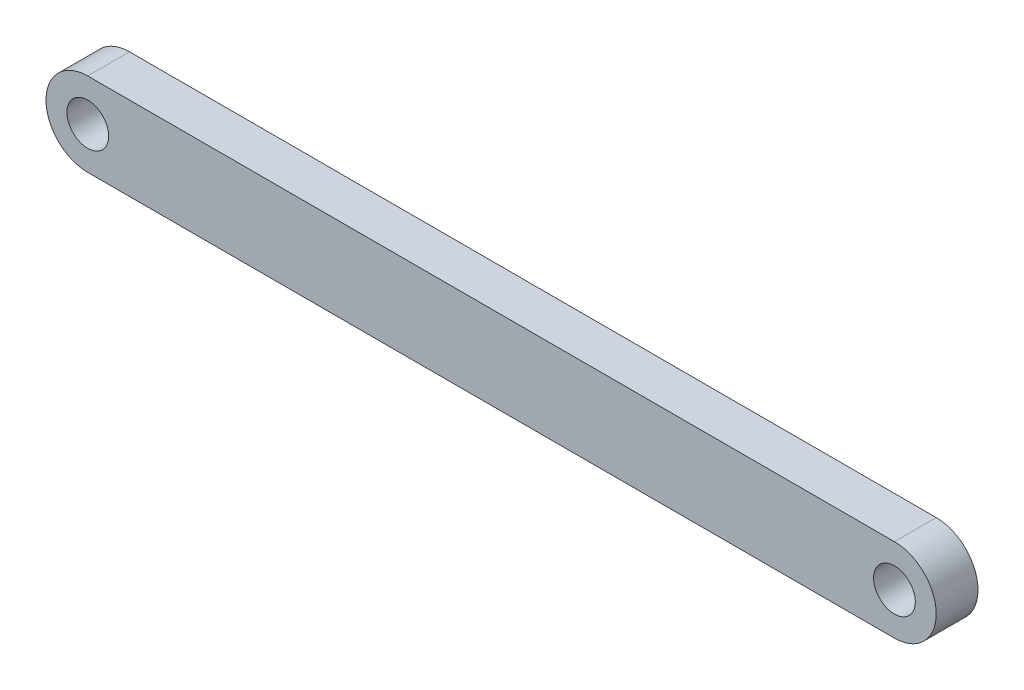
ISO-10303-21;
HEADER;
FILE_DESCRIPTION(('STEP AP214'),'2;1');
FILE_NAME('part.step','',(''),(''),'','','');
FILE_SCHEMA(('AUTOMOTIVE_DESIGN { 1 0 10303 214 1 1 1 1 }'));
ENDSEC;
DATA;
#1=APPLICATION_CONTEXT('core data for automotive mechanical design processes');
#2=APPLICATION_PROTOCOL_DEFINITION('international standard','automotive_design',2000,#1);
#3=PRODUCT_CONTEXT('',#1,'mechanical');
#4=PRODUCT('Part','Part','',(#3));
#5=PRODUCT_RELATED_PRODUCT_CATEGORY('part','',(#4));
#6=PRODUCT_DEFINITION_FORMATION('','',#4);
#7=PRODUCT_DEFINITION_CONTEXT('part definition',#1,'design');
#8=PRODUCT_DEFINITION('design','',#6,#7);
#9=PRODUCT_DEFINITION_SHAPE('','',#8);
#10=(LENGTH_UNIT() NAMED_UNIT(*) SI_UNIT(.MILLI.,.METRE.));
#11=(NAMED_UNIT(*) PLANE_ANGLE_UNIT() SI_UNIT($,.RADIAN.));
#12=(NAMED_UNIT(*) SI_UNIT($,.STERADIAN.) SOLID_ANGLE_UNIT());
#13=UNCERTAINTY_MEASURE_WITH_UNIT(LENGTH_MEASURE(1.E-05),#10,'distance_accuracy_value','');
#14=(GEOMETRIC_REPRESENTATION_CONTEXT(3) GLOBAL_UNCERTAINTY_ASSIGNED_CONTEXT((#13)) GLOBAL_UNIT_ASSIGNED_CONTEXT((#10,
#11,#12)) REPRESENTATION_CONTEXT('',''));
#15=CARTESIAN_POINT('',(0.,0.,0.));
#16=DIRECTION('',(0.,0.,1.));
#17=DIRECTION('',(1.,0.,0.));
#18=AXIS2_PLACEMENT_3D('',#15,#16,#17);
#19=CARTESIAN_POINT('',(12.58,0.,5.));
#20=DIRECTION('',(0.,0.,-1.));
#21=DIRECTION('',(-1.,0.,0.));
#22=AXIS2_PLACEMENT_3D('',#19,#20,#21);
#23=PLANE('',#22);
#24=CARTESIAN_POINT('',(12.58,0.,5.));
#25=DIRECTION('',(0.,0.,1.));
#26=DIRECTION('',(-1.,0.,0.));
#27=AXIS2_PLACEMENT_3D('',#24,#25,#26);
#28=CIRCLE('',#27,5.);
#29=CARTESIAN_POINT('',(12.58,-5.,5.));
#30=VERTEX_POINT('',#29);
#31=CARTESIAN_POINT('',(12.58,5.,5.));
#32=VERTEX_POINT('',#31);
#33=EDGE_CURVE('E96',#30,#32,#28,.T.);
#34=ORIENTED_EDGE('',*,*,#33,.T.);
#35=DIRECTION('',(-1.,0.,0.));
#36=VECTOR('',#35,1.);
#37=CARTESIAN_POINT('',(-83.96,5.,5.));
#38=LINE('',#37,#36);
#39=CARTESIAN_POINT('',(-83.96,5.,5.));
#40=VERTEX_POINT('',#39);
#41=EDGE_CURVE('E91',#32,#40,#38,.T.);
#42=ORIENTED_EDGE('',*,*,#41,.T.);
#43=CARTESIAN_POINT('',(-83.96,0.,5.));
#44=DIRECTION('',(0.,0.,1.));
#45=DIRECTION('',(1.,0.,0.));
#46=AXIS2_PLACEMENT_3D('',#43,#44,#45);
#47=CIRCLE('',#46,5.);
#48=CARTESIAN_POINT('',(-83.96,-5.,5.));
#49=VERTEX_POINT('',#48);
#50=EDGE_CURVE('E94',#40,#49,#47,.T.);
#51=ORIENTED_EDGE('',*,*,#50,.T.);
#52=DIRECTION('',(1.,0.,0.));
#53=VECTOR('',#52,1.);
#54=CARTESIAN_POINT('',(-83.96,-5.,5.));
#55=LINE('',#54,#53);
#56=EDGE_CURVE('E61',#49,#30,#55,.T.);
#57=ORIENTED_EDGE('',*,*,#56,.T.);
#58=EDGE_LOOP('',(#34,#42,#51,#57));
#59=FACE_BOUND('',#58,.T.);
#60=CARTESIAN_POINT('',(12.58,0.,5.));
#61=DIRECTION('',(0.,0.,1.));
#62=DIRECTION('',(1.,0.,0.));
#63=AXIS2_PLACEMENT_3D('',#60,#61,#62);
#64=CIRCLE('',#63,2.5);
#65=CARTESIAN_POINT('',(15.08,0.,5.));
#66=VERTEX_POINT('',#65);
#67=EDGE_CURVE('E116',#66,#66,#64,.T.);
#68=ORIENTED_EDGE('',*,*,#67,.F.);
#69=EDGE_LOOP('',(#68));
#70=FACE_BOUND('',#69,.T.);
#71=CARTESIAN_POINT('',(-83.96,0.,5.));
#72=DIRECTION('',(0.,0.,1.));
#73=DIRECTION('',(1.,0.,0.));
#74=AXIS2_PLACEMENT_3D('',#71,#72,#73);
#75=CIRCLE('',#74,2.5);
#76=CARTESIAN_POINT('',(-81.46,0.,5.));
#77=VERTEX_POINT('',#76);
#78=EDGE_CURVE('E138',#77,#77,#75,.T.);
#79=ORIENTED_EDGE('',*,*,#78,.F.);
#80=EDGE_LOOP('',(#79));
#81=FACE_BOUND('',#80,.T.);
#82=ADVANCED_FACE('F43',(#59,#70,#81),#23,.F.);
#83=CARTESIAN_POINT('',(12.58,0.,0.));
#84=DIRECTION('',(0.,0.,-1.));
#85=DIRECTION('',(-1.,0.,0.));
#86=AXIS2_PLACEMENT_3D('',#83,#84,#85);
#87=PLANE('',#86);
#88=CARTESIAN_POINT('',(12.58,0.,0.));
#89=DIRECTION('',(0.,0.,1.));
#90=DIRECTION('',(1.,0.,0.));
#91=AXIS2_PLACEMENT_3D('',#88,#89,#90);
#92=CIRCLE('',#91,2.5);
#93=CARTESIAN_POINT('',(15.08,0.,0.));
#94=VERTEX_POINT('',#93);
#95=EDGE_CURVE('E134',#94,#94,#92,.T.);
#96=ORIENTED_EDGE('',*,*,#95,.T.);
#97=EDGE_LOOP('',(#96));
#98=FACE_BOUND('',#97,.T.);
#99=CARTESIAN_POINT('',(12.58,0.,0.));
#100=DIRECTION('',(0.,0.,1.));
#101=DIRECTION('',(-1.,0.,0.));
#102=AXIS2_PLACEMENT_3D('',#99,#100,#101);
#103=CIRCLE('',#102,5.);
#104=CARTESIAN_POINT('',(12.58,-5.,0.));
#105=VERTEX_POINT('',#104);
#106=CARTESIAN_POINT('',(12.58,5.,0.));
#107=VERTEX_POINT('',#106);
#108=EDGE_CURVE('E112',#105,#107,#103,.T.);
#109=ORIENTED_EDGE('',*,*,#108,.F.);
#110=DIRECTION('',(1.,0.,0.));
#111=VECTOR('',#110,1.);
#112=CARTESIAN_POINT('',(-83.96,-5.,0.));
#113=LINE('',#112,#111);
#114=CARTESIAN_POINT('',(-83.96,-5.,0.));
#115=VERTEX_POINT('',#114);
#116=EDGE_CURVE('E84',#115,#105,#113,.T.);
#117=ORIENTED_EDGE('',*,*,#116,.F.);
#118=CARTESIAN_POINT('',(-83.96,0.,0.));
#119=DIRECTION('',(0.,0.,1.));
#120=DIRECTION('',(1.,0.,0.));
#121=AXIS2_PLACEMENT_3D('',#118,#119,#120);
#122=CIRCLE('',#121,5.);
#123=CARTESIAN_POINT('',(-83.96,5.,0.));
#124=VERTEX_POINT('',#123);
#125=EDGE_CURVE('E78',#124,#115,#122,.T.);
#126=ORIENTED_EDGE('',*,*,#125,.F.);
#127=DIRECTION('',(-1.,0.,0.));
#128=VECTOR('',#127,1.);
#129=CARTESIAN_POINT('',(-83.96,5.,0.));
#130=LINE('',#129,#128);
#131=EDGE_CURVE('E101',#107,#124,#130,.T.);
#132=ORIENTED_EDGE('',*,*,#131,.F.);
#133=EDGE_LOOP('',(#109,#117,#126,#132));
#134=FACE_BOUND('',#133,.T.);
#135=CARTESIAN_POINT('',(-83.96,0.,0.));
#136=DIRECTION('',(0.,0.,1.));
#137=DIRECTION('',(1.,0.,0.));
#138=AXIS2_PLACEMENT_3D('',#135,#136,#137);
#139=CIRCLE('',#138,2.5);
#140=CARTESIAN_POINT('',(-81.46,0.,0.));
#141=VERTEX_POINT('',#140);
#142=EDGE_CURVE('E142',#141,#141,#139,.T.);
#143=ORIENTED_EDGE('',*,*,#142,.T.);
#144=EDGE_LOOP('',(#143));
#145=FACE_BOUND('',#144,.T.);
#146=ADVANCED_FACE('F129',(#98,#134,#145),#87,.T.);
#147=CARTESIAN_POINT('',(12.58,0.,5.));
#148=DIRECTION('',(0.,0.,-1.));
#149=DIRECTION('',(-1.,0.,0.));
#150=AXIS2_PLACEMENT_3D('',#147,#148,#149);
#151=CYLINDRICAL_SURFACE('',#150,5.);
#152=ORIENTED_EDGE('',*,*,#108,.T.);
#153=DIRECTION('',(0.,0.,-1.));
#154=VECTOR('',#153,1.);
#155=CARTESIAN_POINT('',(12.58,5.,5.));
#156=LINE('',#155,#154);
#157=EDGE_CURVE('E11',#32,#107,#156,.T.);
#158=ORIENTED_EDGE('',*,*,#157,.F.);
#159=ORIENTED_EDGE('',*,*,#33,.F.);
#160=DIRECTION('',(0.,0.,-1.));
#161=VECTOR('',#160,1.);
#162=CARTESIAN_POINT('',(12.58,-5.,5.));
#163=LINE('',#162,#161);
#164=EDGE_CURVE('E108',#30,#105,#163,.T.);
#165=ORIENTED_EDGE('',*,*,#164,.T.);
#166=EDGE_LOOP('',(#152,#158,#159,#165));
#167=FACE_BOUND('',#166,.T.);
#168=ADVANCED_FACE('F45',(#167),#151,.T.);
#169=CARTESIAN_POINT('',(-83.96,5.,5.));
#170=DIRECTION('',(0.,-1.,0.));
#171=DIRECTION('',(0.,0.,-1.));
#172=AXIS2_PLACEMENT_3D('',#169,#170,#171);
#173=PLANE('',#172);
#174=ORIENTED_EDGE('',*,*,#131,.T.);
#175=DIRECTION('',(0.,0.,-1.));
#176=VECTOR('',#175,1.);
#177=CARTESIAN_POINT('',(-83.96,5.,5.));
#178=LINE('',#177,#176);
#179=EDGE_CURVE('E53',#40,#124,#178,.T.);
#180=ORIENTED_EDGE('',*,*,#179,.F.);
#181=ORIENTED_EDGE('',*,*,#41,.F.);
#182=ORIENTED_EDGE('',*,*,#157,.T.);
#183=EDGE_LOOP('',(#174,#180,#181,#182));
#184=FACE_BOUND('',#183,.T.);
#185=ADVANCED_FACE('F100',(#184),#173,.F.);
#186=CARTESIAN_POINT('',(-83.96,0.,5.));
#187=DIRECTION('',(0.,0.,-1.));
#188=DIRECTION('',(-1.,0.,0.));
#189=AXIS2_PLACEMENT_3D('',#186,#187,#188);
#190=CYLINDRICAL_SURFACE('',#189,5.);
#191=ORIENTED_EDGE('',*,*,#125,.T.);
#192=DIRECTION('',(0.,0.,-1.));
#193=VECTOR('',#192,1.);
#194=CARTESIAN_POINT('',(-83.96,-5.,5.));
#195=LINE('',#194,#193);
#196=EDGE_CURVE('E103',#49,#115,#195,.T.);
#197=ORIENTED_EDGE('',*,*,#196,.F.);
#198=ORIENTED_EDGE('',*,*,#50,.F.);
#199=ORIENTED_EDGE('',*,*,#179,.T.);
#200=EDGE_LOOP('',(#191,#197,#198,#199));
#201=FACE_BOUND('',#200,.T.);
#202=ADVANCED_FACE('F104',(#201),#190,.T.);
#203=CARTESIAN_POINT('',(-83.96,-5.,5.));
#204=DIRECTION('',(0.,1.,0.));
#205=DIRECTION('',(0.,0.,1.));
#206=AXIS2_PLACEMENT_3D('',#203,#204,#205);
#207=PLANE('',#206);
#208=ORIENTED_EDGE('',*,*,#116,.T.);
#209=ORIENTED_EDGE('',*,*,#164,.F.);
#210=ORIENTED_EDGE('',*,*,#56,.F.);
#211=ORIENTED_EDGE('',*,*,#196,.T.);
#212=EDGE_LOOP('',(#208,#209,#210,#211));
#213=FACE_BOUND('',#212,.T.);
#214=ADVANCED_FACE('F126',(#213),#207,.F.);
#215=CARTESIAN_POINT('',(12.58,0.,5.));
#216=DIRECTION('',(0.,0.,-1.));
#217=DIRECTION('',(-1.,0.,0.));
#218=AXIS2_PLACEMENT_3D('',#215,#216,#217);
#219=CYLINDRICAL_SURFACE('',#218,2.5);
#220=ORIENTED_EDGE('',*,*,#67,.T.);
#221=EDGE_LOOP('',(#220));
#222=FACE_BOUND('',#221,.T.);
#223=ORIENTED_EDGE('',*,*,#95,.F.);
#224=EDGE_LOOP('',(#223));
#225=FACE_BOUND('',#224,.T.);
#226=ADVANCED_FACE('F161',(#222,#225),#219,.F.);
#227=CARTESIAN_POINT('',(-83.96,0.,5.));
#228=DIRECTION('',(0.,0.,-1.));
#229=DIRECTION('',(-1.,0.,0.));
#230=AXIS2_PLACEMENT_3D('',#227,#228,#229);
#231=CYLINDRICAL_SURFACE('',#230,2.5);
#232=ORIENTED_EDGE('',*,*,#78,.T.);
#233=EDGE_LOOP('',(#232));
#234=FACE_BOUND('',#233,.T.);
#235=ORIENTED_EDGE('',*,*,#142,.F.);
#236=EDGE_LOOP('',(#235));
#237=FACE_BOUND('',#236,.T.);
#238=ADVANCED_FACE('F150',(#234,#237),#231,.F.);
#239=CLOSED_SHELL('',(#82,#146,#168,#185,#202,#214,#226,#238));
#240=MANIFOLD_SOLID_BREP('B2',#239);
#241=ADVANCED_BREP_SHAPE_REPRESENTATION('',(#18,#240),#14);
#242=SHAPE_DEFINITION_REPRESENTATION(#9,#241);
ENDSEC;
END-ISO-10303-21;
